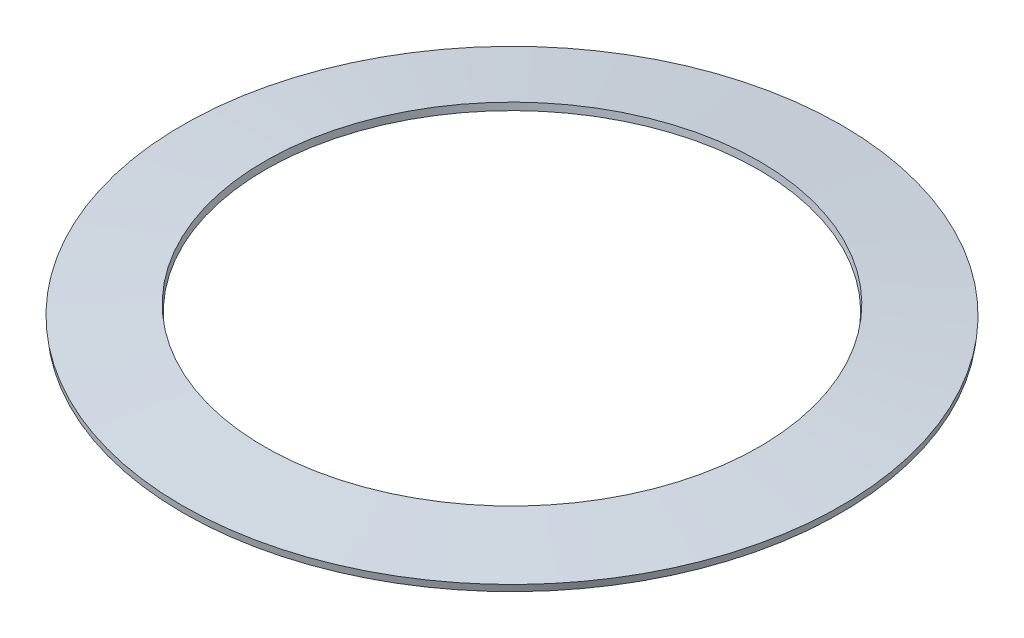
ISO-10303-21;
HEADER;
FILE_DESCRIPTION(('STEP AP214'),'2;1');
FILE_NAME('part.step','',(''),(''),'','','');
FILE_SCHEMA(('AUTOMOTIVE_DESIGN { 1 0 10303 214 1 1 1 1 }'));
ENDSEC;
DATA;
#1=APPLICATION_CONTEXT('core data for automotive mechanical design processes');
#2=APPLICATION_PROTOCOL_DEFINITION('international standard','automotive_design',2000,#1);
#3=PRODUCT_CONTEXT('',#1,'mechanical');
#4=PRODUCT('Part','Part','',(#3));
#5=PRODUCT_RELATED_PRODUCT_CATEGORY('part','',(#4));
#6=PRODUCT_DEFINITION_FORMATION('','',#4);
#7=PRODUCT_DEFINITION_CONTEXT('part definition',#1,'design');
#8=PRODUCT_DEFINITION('design','',#6,#7);
#9=PRODUCT_DEFINITION_SHAPE('','',#8);
#10=(LENGTH_UNIT() NAMED_UNIT(*) SI_UNIT(.MILLI.,.METRE.));
#11=(NAMED_UNIT(*) PLANE_ANGLE_UNIT() SI_UNIT($,.RADIAN.));
#12=(NAMED_UNIT(*) SI_UNIT($,.STERADIAN.) SOLID_ANGLE_UNIT());
#13=UNCERTAINTY_MEASURE_WITH_UNIT(LENGTH_MEASURE(1.E-05),#10,'distance_accuracy_value','');
#14=(GEOMETRIC_REPRESENTATION_CONTEXT(3) GLOBAL_UNCERTAINTY_ASSIGNED_CONTEXT((#13)) GLOBAL_UNIT_ASSIGNED_CONTEXT((#10,
#11,#12)) REPRESENTATION_CONTEXT('',''));
#15=CARTESIAN_POINT('',(0.,0.,0.));
#16=DIRECTION('',(0.,0.,1.));
#17=DIRECTION('',(1.,0.,0.));
#18=AXIS2_PLACEMENT_3D('',#15,#16,#17);
#19=CARTESIAN_POINT('',(0.,0.,0.));
#20=DIRECTION('',(0.,1.,0.));
#21=DIRECTION('',(0.,0.,1.));
#22=AXIS2_PLACEMENT_3D('',#19,#20,#21);
#23=CONICAL_SURFACE('',#22,33.6670139558748,0.118830958856309);
#24=CARTESIAN_POINT('',(0.,0.695063534132281,0.));
#25=DIRECTION('',(0.,-1.,0.));
#26=DIRECTION('',(0.,0.,-1.));
#27=AXIS2_PLACEMENT_3D('',#24,#25,#26);
#28=CIRCLE('',#27,33.75);
#29=CARTESIAN_POINT('',(0.,0.695063534132281,-33.75));
#30=VERTEX_POINT('',#29);
#31=EDGE_CURVE('E52',#30,#30,#28,.T.);
#32=ORIENTED_EDGE('',*,*,#31,.T.);
#33=EDGE_LOOP('',(#32));
#34=FACE_BOUND('',#33,.T.);
#35=CARTESIAN_POINT('',(0.,0.,0.));
#36=DIRECTION('',(0.,-1.,0.));
#37=DIRECTION('',(0.,0.,-1.));
#38=AXIS2_PLACEMENT_3D('',#35,#36,#37);
#39=CIRCLE('',#38,33.6670139558748);
#40=CARTESIAN_POINT('',(0.,0.,-33.6670139558748));
#41=VERTEX_POINT('',#40);
#42=EDGE_CURVE('E10',#41,#41,#39,.T.);
#43=ORIENTED_EDGE('',*,*,#42,.F.);
#44=EDGE_LOOP('',(#43));
#45=FACE_BOUND('',#44,.T.);
#46=ADVANCED_FACE('F38',(#34,#45),#23,.T.);
#47=CARTESIAN_POINT('',(0.,1.00493646586772,0.));
#48=DIRECTION('',(0.,-1.,0.));
#49=DIRECTION('',(0.,0.,-1.));
#50=AXIS2_PLACEMENT_3D('',#47,#48,#49);
#51=CONICAL_SURFACE('',#50,25.25,1.45196536793859);
#52=ORIENTED_EDGE('',*,*,#42,.T.);
#53=EDGE_LOOP('',(#52));
#54=FACE_BOUND('',#53,.T.);
#55=CARTESIAN_POINT('',(0.,1.00493646586772,0.));
#56=DIRECTION('',(0.,-1.,0.));
#57=DIRECTION('',(0.,0.,-1.));
#58=AXIS2_PLACEMENT_3D('',#55,#56,#57);
#59=CIRCLE('',#58,25.25);
#60=CARTESIAN_POINT('',(0.,1.00493646586772,-25.25));
#61=VERTEX_POINT('',#60);
#62=EDGE_CURVE('E44',#61,#61,#59,.T.);
#63=ORIENTED_EDGE('',*,*,#62,.F.);
#64=EDGE_LOOP('',(#63));
#65=FACE_BOUND('',#64,.T.);
#66=ADVANCED_FACE('F68',(#54,#65),#51,.F.);
#67=CARTESIAN_POINT('',(0.,1.7,0.));
#68=DIRECTION('',(0.,1.,0.));
#69=DIRECTION('',(0.,0.,1.));
#70=AXIS2_PLACEMENT_3D('',#67,#68,#69);
#71=CONICAL_SURFACE('',#70,25.3329860441252,0.118830958856304);
#72=ORIENTED_EDGE('',*,*,#62,.T.);
#73=EDGE_LOOP('',(#72));
#74=FACE_BOUND('',#73,.T.);
#75=CARTESIAN_POINT('',(0.,1.7,0.));
#76=DIRECTION('',(0.,-1.,0.));
#77=DIRECTION('',(0.,0.,-1.));
#78=AXIS2_PLACEMENT_3D('',#75,#76,#77);
#79=CIRCLE('',#78,25.3329860441252);
#80=CARTESIAN_POINT('',(0.,1.7,-25.3329860441252));
#81=VERTEX_POINT('',#80);
#82=EDGE_CURVE('E48',#81,#81,#79,.T.);
#83=ORIENTED_EDGE('',*,*,#82,.F.);
#84=EDGE_LOOP('',(#83));
#85=FACE_BOUND('',#84,.T.);
#86=ADVANCED_FACE('F62',(#74,#85),#71,.F.);
#87=CARTESIAN_POINT('',(0.,0.695063534132281,0.));
#88=DIRECTION('',(0.,-1.,0.));
#89=DIRECTION('',(0.,0.,-1.));
#90=AXIS2_PLACEMENT_3D('',#87,#88,#89);
#91=CONICAL_SURFACE('',#90,33.75,1.45196536793859);
#92=ORIENTED_EDGE('',*,*,#82,.T.);
#93=EDGE_LOOP('',(#92));
#94=FACE_BOUND('',#93,.T.);
#95=ORIENTED_EDGE('',*,*,#31,.F.);
#96=EDGE_LOOP('',(#95));
#97=FACE_BOUND('',#96,.T.);
#98=ADVANCED_FACE('F60',(#94,#97),#91,.T.);
#99=CLOSED_SHELL('',(#46,#66,#86,#98));
#100=MANIFOLD_SOLID_BREP('B2',#99);
#101=ADVANCED_BREP_SHAPE_REPRESENTATION('',(#18,#100),#14);
#102=SHAPE_DEFINITION_REPRESENTATION(#9,#101);
ENDSEC;
END-ISO-10303-21;
